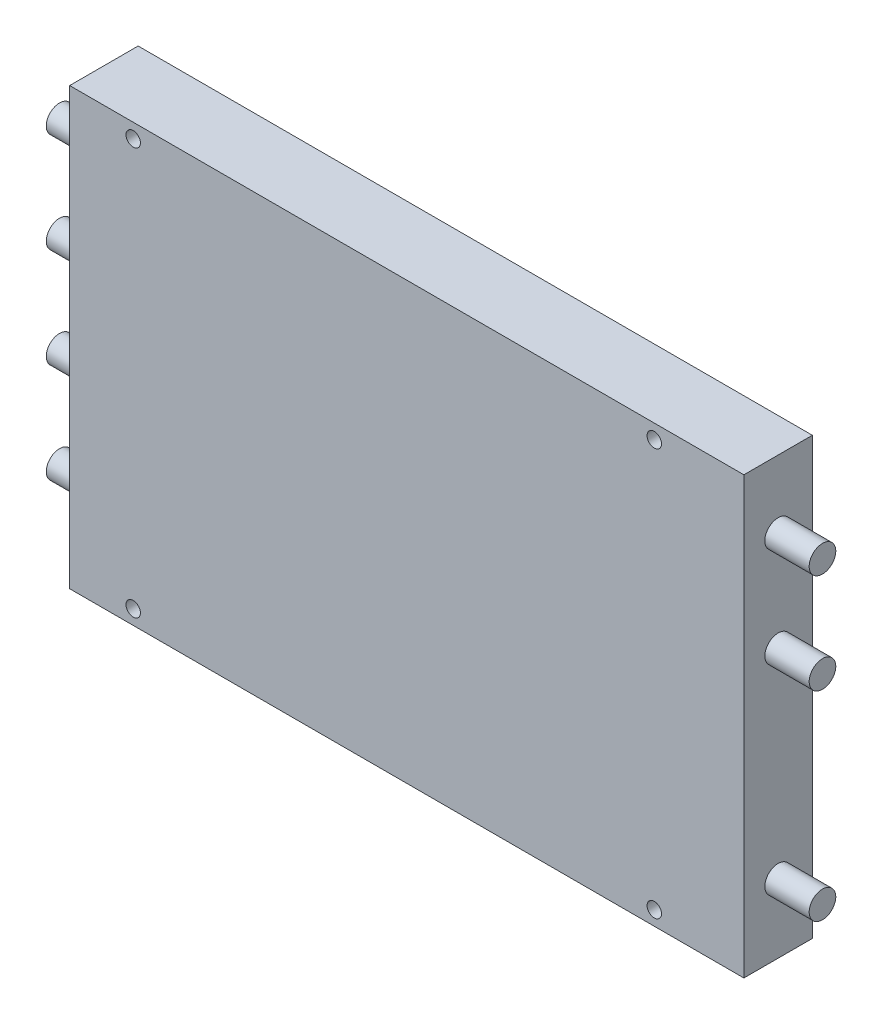
ISO-10303-21;
HEADER;
FILE_DESCRIPTION(('STEP AP214'),'2;1');
FILE_NAME('part.step','',(''),(''),'','','');
FILE_SCHEMA(('AUTOMOTIVE_DESIGN { 1 0 10303 214 1 1 1 1 }'));
ENDSEC;
DATA;
#1=APPLICATION_CONTEXT('core data for automotive mechanical design processes');
#2=APPLICATION_PROTOCOL_DEFINITION('international standard','automotive_design',2000,#1);
#3=PRODUCT_CONTEXT('',#1,'mechanical');
#4=PRODUCT('Part','Part','',(#3));
#5=PRODUCT_RELATED_PRODUCT_CATEGORY('part','',(#4));
#6=PRODUCT_DEFINITION_FORMATION('','',#4);
#7=PRODUCT_DEFINITION_CONTEXT('part definition',#1,'design');
#8=PRODUCT_DEFINITION('design','',#6,#7);
#9=PRODUCT_DEFINITION_SHAPE('','',#8);
#10=(LENGTH_UNIT() NAMED_UNIT(*) SI_UNIT(.MILLI.,.METRE.));
#11=(NAMED_UNIT(*) PLANE_ANGLE_UNIT() SI_UNIT($,.RADIAN.));
#12=(NAMED_UNIT(*) SI_UNIT($,.STERADIAN.) SOLID_ANGLE_UNIT());
#13=UNCERTAINTY_MEASURE_WITH_UNIT(LENGTH_MEASURE(1.E-05),#10,'distance_accuracy_value','');
#14=(GEOMETRIC_REPRESENTATION_CONTEXT(3) GLOBAL_UNCERTAINTY_ASSIGNED_CONTEXT((#13)) GLOBAL_UNIT_ASSIGNED_CONTEXT((#10,
#11,#12)) REPRESENTATION_CONTEXT('',''));
#15=CARTESIAN_POINT('',(0.,0.,0.));
#16=DIRECTION('',(0.,0.,1.));
#17=DIRECTION('',(1.,0.,0.));
#18=AXIS2_PLACEMENT_3D('',#15,#16,#17);
#19=CARTESIAN_POINT('',(77.216,49.911,15.6845));
#20=DIRECTION('',(-1.,0.,0.));
#21=DIRECTION('',(0.,0.,1.));
#22=AXIS2_PLACEMENT_3D('',#19,#20,#21);
#23=PLANE('',#22);
#24=CARTESIAN_POINT('',(77.216,-34.163,7.84225000000001));
#25=DIRECTION('',(-1.,0.,0.));
#26=DIRECTION('',(0.,0.,1.));
#27=AXIS2_PLACEMENT_3D('',#24,#25,#26);
#28=CIRCLE('',#27,3.048);
#29=CARTESIAN_POINT('',(77.216,-34.163,10.89025));
#30=VERTEX_POINT('',#29);
#31=EDGE_CURVE('E124',#30,#30,#28,.T.);
#32=ORIENTED_EDGE('',*,*,#31,.T.);
#33=EDGE_LOOP('',(#32));
#34=FACE_BOUND('',#33,.T.);
#35=CARTESIAN_POINT('',(77.216,11.557,7.84225));
#36=DIRECTION('',(-1.,0.,0.));
#37=DIRECTION('',(0.,0.,1.));
#38=AXIS2_PLACEMENT_3D('',#35,#36,#37);
#39=CIRCLE('',#38,3.048);
#40=CARTESIAN_POINT('',(77.216,11.557,10.89025));
#41=VERTEX_POINT('',#40);
#42=EDGE_CURVE('E120',#41,#41,#39,.T.);
#43=ORIENTED_EDGE('',*,*,#42,.T.);
#44=EDGE_LOOP('',(#43));
#45=FACE_BOUND('',#44,.T.);
#46=CARTESIAN_POINT('',(77.216,34.417,7.84225));
#47=DIRECTION('',(-1.,0.,0.));
#48=DIRECTION('',(0.,0.,1.));
#49=AXIS2_PLACEMENT_3D('',#46,#47,#48);
#50=CIRCLE('',#49,3.048);
#51=CARTESIAN_POINT('',(77.216,34.417,10.89025));
#52=VERTEX_POINT('',#51);
#53=EDGE_CURVE('E107',#52,#52,#50,.T.);
#54=ORIENTED_EDGE('',*,*,#53,.T.);
#55=EDGE_LOOP('',(#54));
#56=FACE_BOUND('',#55,.T.);
#57=DIRECTION('',(0.,1.,0.));
#58=VECTOR('',#57,1.);
#59=CARTESIAN_POINT('',(77.216,49.911,0.));
#60=LINE('',#59,#58);
#61=CARTESIAN_POINT('',(77.216,-49.911,0.));
#62=VERTEX_POINT('',#61);
#63=CARTESIAN_POINT('',(77.216,49.911,0.));
#64=VERTEX_POINT('',#63);
#65=EDGE_CURVE('E104',#62,#64,#60,.T.);
#66=ORIENTED_EDGE('',*,*,#65,.T.);
#67=DIRECTION('',(0.,0.,-1.));
#68=VECTOR('',#67,1.);
#69=CARTESIAN_POINT('',(77.216,49.911,15.6845));
#70=LINE('',#69,#68);
#71=CARTESIAN_POINT('',(77.216,49.911,15.6845));
#72=VERTEX_POINT('',#71);
#73=EDGE_CURVE('E46',#72,#64,#70,.T.);
#74=ORIENTED_EDGE('',*,*,#73,.F.);
#75=DIRECTION('',(0.,1.,0.));
#76=VECTOR('',#75,1.);
#77=CARTESIAN_POINT('',(77.216,49.911,15.6845));
#78=LINE('',#77,#76);
#79=CARTESIAN_POINT('',(77.216,-49.911,15.6845));
#80=VERTEX_POINT('',#79);
#81=EDGE_CURVE('E90',#80,#72,#78,.T.);
#82=ORIENTED_EDGE('',*,*,#81,.F.);
#83=DIRECTION('',(0.,0.,-1.));
#84=VECTOR('',#83,1.);
#85=CARTESIAN_POINT('',(77.216,-49.911,15.6845));
#86=LINE('',#85,#84);
#87=EDGE_CURVE('E100',#80,#62,#86,.T.);
#88=ORIENTED_EDGE('',*,*,#87,.T.);
#89=EDGE_LOOP('',(#66,#74,#82,#88));
#90=FACE_BOUND('',#89,.T.);
#91=ADVANCED_FACE('F38',(#34,#45,#56,#90),#23,.F.);
#92=CARTESIAN_POINT('',(-77.216,49.911,15.6845));
#93=DIRECTION('',(0.,-1.,0.));
#94=DIRECTION('',(0.,0.,-1.));
#95=AXIS2_PLACEMENT_3D('',#92,#93,#94);
#96=PLANE('',#95);
#97=DIRECTION('',(-1.,0.,0.));
#98=VECTOR('',#97,1.);
#99=CARTESIAN_POINT('',(-77.216,49.911,0.));
#100=LINE('',#99,#98);
#101=CARTESIAN_POINT('',(-77.216,49.911,0.));
#102=VERTEX_POINT('',#101);
#103=EDGE_CURVE('E95',#64,#102,#100,.T.);
#104=ORIENTED_EDGE('',*,*,#103,.T.);
#105=DIRECTION('',(0.,0.,-1.));
#106=VECTOR('',#105,1.);
#107=CARTESIAN_POINT('',(-77.216,49.911,15.6845));
#108=LINE('',#107,#106);
#109=CARTESIAN_POINT('',(-77.216,49.911,15.6845));
#110=VERTEX_POINT('',#109);
#111=EDGE_CURVE('E93',#110,#102,#108,.T.);
#112=ORIENTED_EDGE('',*,*,#111,.F.);
#113=DIRECTION('',(-1.,0.,0.));
#114=VECTOR('',#113,1.);
#115=CARTESIAN_POINT('',(-77.216,49.911,15.6845));
#116=LINE('',#115,#114);
#117=EDGE_CURVE('E85',#72,#110,#116,.T.);
#118=ORIENTED_EDGE('',*,*,#117,.F.);
#119=ORIENTED_EDGE('',*,*,#73,.T.);
#120=EDGE_LOOP('',(#104,#112,#118,#119));
#121=FACE_BOUND('',#120,.T.);
#122=ADVANCED_FACE('F94',(#121),#96,.F.);
#123=CARTESIAN_POINT('',(-77.216,49.911,15.6845));
#124=DIRECTION('',(1.,0.,0.));
#125=DIRECTION('',(0.,0.,-1.));
#126=AXIS2_PLACEMENT_3D('',#123,#124,#125);
#127=PLANE('',#126);
#128=CARTESIAN_POINT('',(-77.216,-11.303,7.84225000000001));
#129=DIRECTION('',(1.,0.,0.));
#130=DIRECTION('',(0.,0.,-1.));
#131=AXIS2_PLACEMENT_3D('',#128,#129,#130);
#132=CIRCLE('',#131,3.048);
#133=CARTESIAN_POINT('',(-77.216,-11.303,4.79425000000001));
#134=VERTEX_POINT('',#133);
#135=EDGE_CURVE('E12',#134,#134,#132,.F.);
#136=ORIENTED_EDGE('',*,*,#135,.F.);
#137=EDGE_LOOP('',(#136));
#138=FACE_BOUND('',#137,.T.);
#139=CARTESIAN_POINT('',(-77.216,-34.163,7.84225000000001));
#140=DIRECTION('',(1.,0.,0.));
#141=DIRECTION('',(0.,0.,-1.));
#142=AXIS2_PLACEMENT_3D('',#139,#140,#141);
#143=CIRCLE('',#142,3.048);
#144=CARTESIAN_POINT('',(-77.216,-34.163,4.79425000000001));
#145=VERTEX_POINT('',#144);
#146=EDGE_CURVE('E122',#145,#145,#143,.T.);
#147=ORIENTED_EDGE('',*,*,#146,.T.);
#148=EDGE_LOOP('',(#147));
#149=FACE_BOUND('',#148,.T.);
#150=CARTESIAN_POINT('',(-77.216,11.557,7.84225));
#151=DIRECTION('',(1.,0.,0.));
#152=DIRECTION('',(0.,0.,-1.));
#153=AXIS2_PLACEMENT_3D('',#150,#151,#152);
#154=CIRCLE('',#153,3.048);
#155=CARTESIAN_POINT('',(-77.216,11.557,4.79425));
#156=VERTEX_POINT('',#155);
#157=EDGE_CURVE('E118',#156,#156,#154,.T.);
#158=ORIENTED_EDGE('',*,*,#157,.T.);
#159=EDGE_LOOP('',(#158));
#160=FACE_BOUND('',#159,.T.);
#161=CARTESIAN_POINT('',(-77.216,34.417,7.84225));
#162=DIRECTION('',(1.,0.,0.));
#163=DIRECTION('',(0.,0.,-1.));
#164=AXIS2_PLACEMENT_3D('',#161,#162,#163);
#165=CIRCLE('',#164,3.048);
#166=CARTESIAN_POINT('',(-77.216,34.417,4.79425));
#167=VERTEX_POINT('',#166);
#168=EDGE_CURVE('E114',#167,#167,#165,.T.);
#169=ORIENTED_EDGE('',*,*,#168,.T.);
#170=EDGE_LOOP('',(#169));
#171=FACE_BOUND('',#170,.T.);
#172=DIRECTION('',(0.,-1.,0.));
#173=VECTOR('',#172,1.);
#174=CARTESIAN_POINT('',(-77.216,49.911,0.));
#175=LINE('',#174,#173);
#176=CARTESIAN_POINT('',(-77.216,-49.911,0.));
#177=VERTEX_POINT('',#176);
#178=EDGE_CURVE('E71',#102,#177,#175,.T.);
#179=ORIENTED_EDGE('',*,*,#178,.T.);
#180=DIRECTION('',(0.,0.,-1.));
#181=VECTOR('',#180,1.);
#182=CARTESIAN_POINT('',(-77.216,-49.911,15.6845));
#183=LINE('',#182,#181);
#184=CARTESIAN_POINT('',(-77.216,-49.911,15.6845));
#185=VERTEX_POINT('',#184);
#186=EDGE_CURVE('E96',#185,#177,#183,.T.);
#187=ORIENTED_EDGE('',*,*,#186,.F.);
#188=DIRECTION('',(0.,-1.,0.));
#189=VECTOR('',#188,1.);
#190=CARTESIAN_POINT('',(-77.216,49.911,15.6845));
#191=LINE('',#190,#189);
#192=EDGE_CURVE('E88',#110,#185,#191,.T.);
#193=ORIENTED_EDGE('',*,*,#192,.F.);
#194=ORIENTED_EDGE('',*,*,#111,.T.);
#195=EDGE_LOOP('',(#179,#187,#193,#194));
#196=FACE_BOUND('',#195,.T.);
#197=ADVANCED_FACE('F98',(#138,#149,#160,#171,#196),#127,.F.);
#198=CARTESIAN_POINT('',(-77.216,-49.911,15.6845));
#199=DIRECTION('',(0.,1.,0.));
#200=DIRECTION('',(0.,0.,1.));
#201=AXIS2_PLACEMENT_3D('',#198,#199,#200);
#202=PLANE('',#201);
#203=DIRECTION('',(1.,0.,0.));
#204=VECTOR('',#203,1.);
#205=CARTESIAN_POINT('',(-77.216,-49.911,0.));
#206=LINE('',#205,#204);
#207=EDGE_CURVE('E77',#177,#62,#206,.T.);
#208=ORIENTED_EDGE('',*,*,#207,.T.);
#209=ORIENTED_EDGE('',*,*,#87,.F.);
#210=DIRECTION('',(1.,0.,0.));
#211=VECTOR('',#210,1.);
#212=CARTESIAN_POINT('',(-77.216,-49.911,15.6845));
#213=LINE('',#212,#211);
#214=EDGE_CURVE('E54',#185,#80,#213,.T.);
#215=ORIENTED_EDGE('',*,*,#214,.F.);
#216=ORIENTED_EDGE('',*,*,#186,.T.);
#217=EDGE_LOOP('',(#208,#209,#215,#216));
#218=FACE_BOUND('',#217,.T.);
#219=ADVANCED_FACE('F213',(#218),#202,.F.);
#220=CARTESIAN_POINT('',(0.,0.,15.6845));
#221=DIRECTION('',(0.,0.,1.));
#222=DIRECTION('',(1.,0.,0.));
#223=AXIS2_PLACEMENT_3D('',#220,#221,#222);
#224=PLANE('',#223);
#225=CARTESIAN_POINT('',(56.6928,46.609,15.6845));
#226=DIRECTION('',(0.,0.,1.));
#227=DIRECTION('',(1.,0.,0.));
#228=AXIS2_PLACEMENT_3D('',#225,#226,#227);
#229=CIRCLE('',#228,1.651);
#230=CARTESIAN_POINT('',(58.3438,46.609,15.6845));
#231=VERTEX_POINT('',#230);
#232=EDGE_CURVE('E228',#231,#231,#229,.T.);
#233=ORIENTED_EDGE('',*,*,#232,.F.);
#234=EDGE_LOOP('',(#233));
#235=FACE_BOUND('',#234,.T.);
#236=CARTESIAN_POINT('',(56.6928,-46.609,15.6845));
#237=DIRECTION('',(0.,0.,1.));
#238=DIRECTION('',(1.,0.,0.));
#239=AXIS2_PLACEMENT_3D('',#236,#237,#238);
#240=CIRCLE('',#239,1.651);
#241=CARTESIAN_POINT('',(58.3438,-46.609,15.6845));
#242=VERTEX_POINT('',#241);
#243=EDGE_CURVE('E232',#242,#242,#240,.T.);
#244=ORIENTED_EDGE('',*,*,#243,.F.);
#245=EDGE_LOOP('',(#244));
#246=FACE_BOUND('',#245,.T.);
#247=CARTESIAN_POINT('',(-62.6618,-46.609,15.6845));
#248=DIRECTION('',(0.,0.,1.));
#249=DIRECTION('',(1.,0.,0.));
#250=AXIS2_PLACEMENT_3D('',#247,#248,#249);
#251=CIRCLE('',#250,1.651);
#252=CARTESIAN_POINT('',(-61.0108,-46.609,15.6845));
#253=VERTEX_POINT('',#252);
#254=EDGE_CURVE('E236',#253,#253,#251,.T.);
#255=ORIENTED_EDGE('',*,*,#254,.F.);
#256=EDGE_LOOP('',(#255));
#257=FACE_BOUND('',#256,.T.);
#258=CARTESIAN_POINT('',(-62.6618,46.609,15.6845));
#259=DIRECTION('',(0.,0.,1.));
#260=DIRECTION('',(1.,0.,0.));
#261=AXIS2_PLACEMENT_3D('',#258,#259,#260);
#262=CIRCLE('',#261,1.651);
#263=CARTESIAN_POINT('',(-61.0108,46.609,15.6845));
#264=VERTEX_POINT('',#263);
#265=EDGE_CURVE('E239',#264,#264,#262,.T.);
#266=ORIENTED_EDGE('',*,*,#265,.F.);
#267=EDGE_LOOP('',(#266));
#268=FACE_BOUND('',#267,.T.);
#269=ORIENTED_EDGE('',*,*,#81,.T.);
#270=ORIENTED_EDGE('',*,*,#117,.T.);
#271=ORIENTED_EDGE('',*,*,#192,.T.);
#272=ORIENTED_EDGE('',*,*,#214,.T.);
#273=EDGE_LOOP('',(#269,#270,#271,#272));
#274=FACE_BOUND('',#273,.T.);
#275=ADVANCED_FACE('F86',(#235,#246,#257,#268,#274),#224,.T.);
#276=CARTESIAN_POINT('',(0.,0.,0.));
#277=DIRECTION('',(0.,0.,1.));
#278=DIRECTION('',(1.,0.,0.));
#279=AXIS2_PLACEMENT_3D('',#276,#277,#278);
#280=PLANE('',#279);
#281=CARTESIAN_POINT('',(56.6928,46.609,0.));
#282=DIRECTION('',(0.,0.,1.));
#283=DIRECTION('',(1.,0.,0.));
#284=AXIS2_PLACEMENT_3D('',#281,#282,#283);
#285=CIRCLE('',#284,1.651);
#286=CARTESIAN_POINT('',(58.3438,46.609,0.));
#287=VERTEX_POINT('',#286);
#288=EDGE_CURVE('E247',#287,#287,#285,.T.);
#289=ORIENTED_EDGE('',*,*,#288,.T.);
#290=EDGE_LOOP('',(#289));
#291=FACE_BOUND('',#290,.T.);
#292=CARTESIAN_POINT('',(56.6928,-46.609,0.));
#293=DIRECTION('',(0.,0.,1.));
#294=DIRECTION('',(1.,0.,0.));
#295=AXIS2_PLACEMENT_3D('',#292,#293,#294);
#296=CIRCLE('',#295,1.651);
#297=CARTESIAN_POINT('',(58.3438,-46.609,0.));
#298=VERTEX_POINT('',#297);
#299=EDGE_CURVE('E251',#298,#298,#296,.T.);
#300=ORIENTED_EDGE('',*,*,#299,.T.);
#301=EDGE_LOOP('',(#300));
#302=FACE_BOUND('',#301,.T.);
#303=CARTESIAN_POINT('',(-62.6618,-46.609,0.));
#304=DIRECTION('',(0.,0.,1.));
#305=DIRECTION('',(1.,0.,0.));
#306=AXIS2_PLACEMENT_3D('',#303,#304,#305);
#307=CIRCLE('',#306,1.651);
#308=CARTESIAN_POINT('',(-61.0108,-46.609,0.));
#309=VERTEX_POINT('',#308);
#310=EDGE_CURVE('E255',#309,#309,#307,.T.);
#311=ORIENTED_EDGE('',*,*,#310,.T.);
#312=EDGE_LOOP('',(#311));
#313=FACE_BOUND('',#312,.T.);
#314=CARTESIAN_POINT('',(-62.6618,46.609,0.));
#315=DIRECTION('',(0.,0.,1.));
#316=DIRECTION('',(1.,0.,0.));
#317=AXIS2_PLACEMENT_3D('',#314,#315,#316);
#318=CIRCLE('',#317,1.651);
#319=CARTESIAN_POINT('',(-61.0108,46.609,0.));
#320=VERTEX_POINT('',#319);
#321=EDGE_CURVE('E241',#320,#320,#318,.T.);
#322=ORIENTED_EDGE('',*,*,#321,.T.);
#323=EDGE_LOOP('',(#322));
#324=FACE_BOUND('',#323,.T.);
#325=ORIENTED_EDGE('',*,*,#65,.F.);
#326=ORIENTED_EDGE('',*,*,#207,.F.);
#327=ORIENTED_EDGE('',*,*,#178,.F.);
#328=ORIENTED_EDGE('',*,*,#103,.F.);
#329=EDGE_LOOP('',(#325,#326,#327,#328));
#330=FACE_BOUND('',#329,.T.);
#331=ADVANCED_FACE('F201',(#291,#302,#313,#324,#330),#280,.F.);
#332=CARTESIAN_POINT('',(-87.376,0.,0.));
#333=DIRECTION('',(-1.,0.,0.));
#334=DIRECTION('',(0.,0.,1.));
#335=AXIS2_PLACEMENT_3D('',#332,#333,#334);
#336=PLANE('',#335);
#337=CARTESIAN_POINT('',(-87.376,34.417,7.84225));
#338=DIRECTION('',(-1.,0.,0.));
#339=DIRECTION('',(0.,0.,1.));
#340=AXIS2_PLACEMENT_3D('',#337,#338,#339);
#341=CIRCLE('',#340,3.048);
#342=CARTESIAN_POINT('',(-87.376,34.417,10.89025));
#343=VERTEX_POINT('',#342);
#344=EDGE_CURVE('E147',#343,#343,#341,.T.);
#345=ORIENTED_EDGE('',*,*,#344,.T.);
#346=EDGE_LOOP('',(#345));
#347=FACE_BOUND('',#346,.T.);
#348=ADVANCED_FACE('F170',(#347),#336,.T.);
#349=CARTESIAN_POINT('',(106.157045876226,34.417,7.84225));
#350=DIRECTION('',(-1.,0.,0.));
#351=DIRECTION('',(0.,0.,1.));
#352=AXIS2_PLACEMENT_3D('',#349,#350,#351);
#353=CYLINDRICAL_SURFACE('',#352,3.048);
#354=ORIENTED_EDGE('',*,*,#344,.F.);
#355=EDGE_LOOP('',(#354));
#356=FACE_BOUND('',#355,.T.);
#357=ORIENTED_EDGE('',*,*,#168,.F.);
#358=EDGE_LOOP('',(#357));
#359=FACE_BOUND('',#358,.T.);
#360=ADVANCED_FACE('F160',(#356,#359),#353,.T.);
#361=CARTESIAN_POINT('',(87.376,34.417,7.84225));
#362=DIRECTION('',(-1.,0.,0.));
#363=DIRECTION('',(0.,0.,1.));
#364=AXIS2_PLACEMENT_3D('',#361,#362,#363);
#365=CIRCLE('',#364,3.048);
#366=CARTESIAN_POINT('',(87.376,34.417,10.89025));
#367=VERTEX_POINT('',#366);
#368=EDGE_CURVE('E117',#367,#367,#365,.F.);
#369=ORIENTED_EDGE('',*,*,#368,.F.);
#370=EDGE_LOOP('',(#369));
#371=FACE_BOUND('',#370,.T.);
#372=ORIENTED_EDGE('',*,*,#53,.F.);
#373=EDGE_LOOP('',(#372));
#374=FACE_BOUND('',#373,.T.);
#375=ADVANCED_FACE('F157',(#371,#374),#353,.T.);
#376=CARTESIAN_POINT('',(87.376,49.911,15.6845));
#377=DIRECTION('',(-1.,0.,0.));
#378=DIRECTION('',(0.,0.,1.));
#379=AXIS2_PLACEMENT_3D('',#376,#377,#378);
#380=PLANE('',#379);
#381=ORIENTED_EDGE('',*,*,#368,.T.);
#382=EDGE_LOOP('',(#381));
#383=FACE_BOUND('',#382,.T.);
#384=ADVANCED_FACE('F159',(#383),#380,.F.);
#385=CARTESIAN_POINT('',(-87.376,0.,0.));
#386=DIRECTION('',(-1.,0.,0.));
#387=DIRECTION('',(0.,0.,1.));
#388=AXIS2_PLACEMENT_3D('',#385,#386,#387);
#389=PLANE('',#388);
#390=CARTESIAN_POINT('',(-87.376,11.557,7.84225));
#391=DIRECTION('',(-1.,0.,0.));
#392=DIRECTION('',(0.,0.,1.));
#393=AXIS2_PLACEMENT_3D('',#390,#391,#392);
#394=CIRCLE('',#393,3.048);
#395=CARTESIAN_POINT('',(-87.376,11.557,10.89025));
#396=VERTEX_POINT('',#395);
#397=EDGE_CURVE('E129',#396,#396,#394,.T.);
#398=ORIENTED_EDGE('',*,*,#397,.T.);
#399=EDGE_LOOP('',(#398));
#400=FACE_BOUND('',#399,.T.);
#401=ADVANCED_FACE('F167',(#400),#389,.T.);
#402=CARTESIAN_POINT('',(106.157045876226,11.557,7.84225));
#403=DIRECTION('',(-1.,0.,0.));
#404=DIRECTION('',(0.,0.,1.));
#405=AXIS2_PLACEMENT_3D('',#402,#403,#404);
#406=CYLINDRICAL_SURFACE('',#405,3.048);
#407=ORIENTED_EDGE('',*,*,#397,.F.);
#408=EDGE_LOOP('',(#407));
#409=FACE_BOUND('',#408,.T.);
#410=ORIENTED_EDGE('',*,*,#157,.F.);
#411=EDGE_LOOP('',(#410));
#412=FACE_BOUND('',#411,.T.);
#413=ADVANCED_FACE('F186',(#409,#412),#406,.T.);
#414=CARTESIAN_POINT('',(87.376,11.557,7.84225));
#415=DIRECTION('',(-1.,0.,0.));
#416=DIRECTION('',(0.,0.,1.));
#417=AXIS2_PLACEMENT_3D('',#414,#415,#416);
#418=CIRCLE('',#417,3.048);
#419=CARTESIAN_POINT('',(87.376,11.557,10.89025));
#420=VERTEX_POINT('',#419);
#421=EDGE_CURVE('E121',#420,#420,#418,.F.);
#422=ORIENTED_EDGE('',*,*,#421,.F.);
#423=EDGE_LOOP('',(#422));
#424=FACE_BOUND('',#423,.T.);
#425=ORIENTED_EDGE('',*,*,#42,.F.);
#426=EDGE_LOOP('',(#425));
#427=FACE_BOUND('',#426,.T.);
#428=ADVANCED_FACE('F183',(#424,#427),#406,.T.);
#429=CARTESIAN_POINT('',(87.376,49.911,15.6845));
#430=DIRECTION('',(-1.,0.,0.));
#431=DIRECTION('',(0.,0.,1.));
#432=AXIS2_PLACEMENT_3D('',#429,#430,#431);
#433=PLANE('',#432);
#434=ORIENTED_EDGE('',*,*,#421,.T.);
#435=EDGE_LOOP('',(#434));
#436=FACE_BOUND('',#435,.T.);
#437=ADVANCED_FACE('F185',(#436),#433,.F.);
#438=CARTESIAN_POINT('',(-87.376,0.,0.));
#439=DIRECTION('',(-1.,0.,0.));
#440=DIRECTION('',(0.,0.,1.));
#441=AXIS2_PLACEMENT_3D('',#438,#439,#440);
#442=PLANE('',#441);
#443=CARTESIAN_POINT('',(-87.376,-34.163,7.84225000000001));
#444=DIRECTION('',(-1.,0.,0.));
#445=DIRECTION('',(0.,0.,1.));
#446=AXIS2_PLACEMENT_3D('',#443,#444,#445);
#447=CIRCLE('',#446,3.048);
#448=CARTESIAN_POINT('',(-87.376,-34.163,10.89025));
#449=VERTEX_POINT('',#448);
#450=EDGE_CURVE('E132',#449,#449,#447,.T.);
#451=ORIENTED_EDGE('',*,*,#450,.T.);
#452=EDGE_LOOP('',(#451));
#453=FACE_BOUND('',#452,.T.);
#454=ADVANCED_FACE('F193',(#453),#442,.T.);
#455=CARTESIAN_POINT('',(106.157045876226,-34.163,7.84225000000001));
#456=DIRECTION('',(-1.,0.,0.));
#457=DIRECTION('',(0.,0.,1.));
#458=AXIS2_PLACEMENT_3D('',#455,#456,#457);
#459=CYLINDRICAL_SURFACE('',#458,3.048);
#460=ORIENTED_EDGE('',*,*,#450,.F.);
#461=EDGE_LOOP('',(#460));
#462=FACE_BOUND('',#461,.T.);
#463=ORIENTED_EDGE('',*,*,#146,.F.);
#464=EDGE_LOOP('',(#463));
#465=FACE_BOUND('',#464,.T.);
#466=ADVANCED_FACE('F291',(#462,#465),#459,.T.);
#467=CARTESIAN_POINT('',(87.376,-34.163,7.84225000000001));
#468=DIRECTION('',(-1.,0.,0.));
#469=DIRECTION('',(0.,0.,1.));
#470=AXIS2_PLACEMENT_3D('',#467,#468,#469);
#471=CIRCLE('',#470,3.048);
#472=CARTESIAN_POINT('',(87.376,-34.163,10.89025));
#473=VERTEX_POINT('',#472);
#474=EDGE_CURVE('E125',#473,#473,#471,.F.);
#475=ORIENTED_EDGE('',*,*,#474,.F.);
#476=EDGE_LOOP('',(#475));
#477=FACE_BOUND('',#476,.T.);
#478=ORIENTED_EDGE('',*,*,#31,.F.);
#479=EDGE_LOOP('',(#478));
#480=FACE_BOUND('',#479,.T.);
#481=ADVANCED_FACE('F295',(#477,#480),#459,.T.);
#482=CARTESIAN_POINT('',(87.376,49.911,15.6845));
#483=DIRECTION('',(-1.,0.,0.));
#484=DIRECTION('',(0.,0.,1.));
#485=AXIS2_PLACEMENT_3D('',#482,#483,#484);
#486=PLANE('',#485);
#487=ORIENTED_EDGE('',*,*,#474,.T.);
#488=EDGE_LOOP('',(#487));
#489=FACE_BOUND('',#488,.T.);
#490=ADVANCED_FACE('F287',(#489),#486,.F.);
#491=CARTESIAN_POINT('',(-87.376,-11.303,7.84225000000001));
#492=DIRECTION('',(1.,0.,0.));
#493=DIRECTION('',(0.,0.,-1.));
#494=AXIS2_PLACEMENT_3D('',#491,#492,#493);
#495=CYLINDRICAL_SURFACE('',#494,3.048);
#496=CARTESIAN_POINT('',(-87.376,-11.303,7.84225000000001));
#497=DIRECTION('',(-1.,0.,0.));
#498=DIRECTION('',(0.,0.,1.));
#499=AXIS2_PLACEMENT_3D('',#496,#497,#498);
#500=CIRCLE('',#499,3.048);
#501=CARTESIAN_POINT('',(-87.376,-11.303,10.89025));
#502=VERTEX_POINT('',#501);
#503=EDGE_CURVE('E137',#502,#502,#500,.T.);
#504=ORIENTED_EDGE('',*,*,#503,.F.);
#505=EDGE_LOOP('',(#504));
#506=FACE_BOUND('',#505,.T.);
#507=ORIENTED_EDGE('',*,*,#135,.T.);
#508=EDGE_LOOP('',(#507));
#509=FACE_BOUND('',#508,.T.);
#510=ADVANCED_FACE('F278',(#506,#509),#495,.T.);
#511=CARTESIAN_POINT('',(-87.376,0.,0.));
#512=DIRECTION('',(-1.,0.,0.));
#513=DIRECTION('',(0.,0.,1.));
#514=AXIS2_PLACEMENT_3D('',#511,#512,#513);
#515=PLANE('',#514);
#516=ORIENTED_EDGE('',*,*,#503,.T.);
#517=EDGE_LOOP('',(#516));
#518=FACE_BOUND('',#517,.T.);
#519=ADVANCED_FACE('F273',(#518),#515,.T.);
#520=CARTESIAN_POINT('',(-62.6618,46.609,15.6845));
#521=DIRECTION('',(0.,0.,-1.));
#522=DIRECTION('',(-1.,0.,0.));
#523=AXIS2_PLACEMENT_3D('',#520,#521,#522);
#524=CYLINDRICAL_SURFACE('',#523,1.651);
#525=ORIENTED_EDGE('',*,*,#265,.T.);
#526=EDGE_LOOP('',(#525));
#527=FACE_BOUND('',#526,.T.);
#528=ORIENTED_EDGE('',*,*,#321,.F.);
#529=EDGE_LOOP('',(#528));
#530=FACE_BOUND('',#529,.T.);
#531=ADVANCED_FACE('F263',(#527,#530),#524,.F.);
#532=CARTESIAN_POINT('',(-62.6618,-46.609,15.6845));
#533=DIRECTION('',(0.,0.,-1.));
#534=DIRECTION('',(-1.,0.,0.));
#535=AXIS2_PLACEMENT_3D('',#532,#533,#534);
#536=CYLINDRICAL_SURFACE('',#535,1.651);
#537=ORIENTED_EDGE('',*,*,#254,.T.);
#538=EDGE_LOOP('',(#537));
#539=FACE_BOUND('',#538,.T.);
#540=ORIENTED_EDGE('',*,*,#310,.F.);
#541=EDGE_LOOP('',(#540));
#542=FACE_BOUND('',#541,.T.);
#543=ADVANCED_FACE('F259',(#539,#542),#536,.F.);
#544=CARTESIAN_POINT('',(56.6928,-46.609,15.6845));
#545=DIRECTION('',(0.,0.,-1.));
#546=DIRECTION('',(-1.,0.,0.));
#547=AXIS2_PLACEMENT_3D('',#544,#545,#546);
#548=CYLINDRICAL_SURFACE('',#547,1.651);
#549=ORIENTED_EDGE('',*,*,#243,.T.);
#550=EDGE_LOOP('',(#549));
#551=FACE_BOUND('',#550,.T.);
#552=ORIENTED_EDGE('',*,*,#299,.F.);
#553=EDGE_LOOP('',(#552));
#554=FACE_BOUND('',#553,.T.);
#555=ADVANCED_FACE('F262',(#551,#554),#548,.F.);
#556=CARTESIAN_POINT('',(56.6928,46.609,15.6845));
#557=DIRECTION('',(0.,0.,-1.));
#558=DIRECTION('',(-1.,0.,0.));
#559=AXIS2_PLACEMENT_3D('',#556,#557,#558);
#560=CYLINDRICAL_SURFACE('',#559,1.651);
#561=ORIENTED_EDGE('',*,*,#232,.T.);
#562=EDGE_LOOP('',(#561));
#563=FACE_BOUND('',#562,.T.);
#564=ORIENTED_EDGE('',*,*,#288,.F.);
#565=EDGE_LOOP('',(#564));
#566=FACE_BOUND('',#565,.T.);
#567=ADVANCED_FACE('F282',(#563,#566),#560,.F.);
#568=CLOSED_SHELL('',(#91,#122,#197,#219,#275,#331,#348,#360,#375,#384,#401,#413,#428,#437,#454,
#466,#481,#490,#510,#519,#531,#543,#555,#567));
#569=MANIFOLD_SOLID_BREP('B2',#568);
#570=ADVANCED_BREP_SHAPE_REPRESENTATION('',(#18,#569),#14);
#571=SHAPE_DEFINITION_REPRESENTATION(#9,#570);
ENDSEC;
END-ISO-10303-21;
